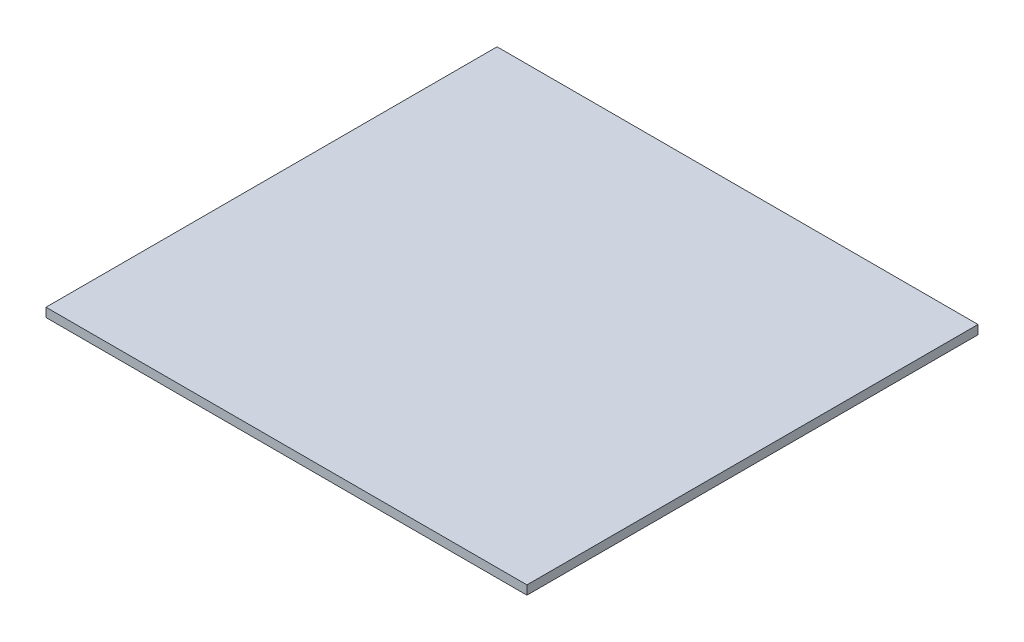
ISO-10303-21;
HEADER;
FILE_DESCRIPTION(('STEP AP214'),'2;1');
FILE_NAME('part.step','',(''),(''),'','','');
FILE_SCHEMA(('AUTOMOTIVE_DESIGN { 1 0 10303 214 1 1 1 1 }'));
ENDSEC;
DATA;
#1=APPLICATION_CONTEXT('core data for automotive mechanical design processes');
#2=APPLICATION_PROTOCOL_DEFINITION('international standard','automotive_design',2000,#1);
#3=PRODUCT_CONTEXT('',#1,'mechanical');
#4=PRODUCT('Part','Part','',(#3));
#5=PRODUCT_RELATED_PRODUCT_CATEGORY('part','',(#4));
#6=PRODUCT_DEFINITION_FORMATION('','',#4);
#7=PRODUCT_DEFINITION_CONTEXT('part definition',#1,'design');
#8=PRODUCT_DEFINITION('design','',#6,#7);
#9=PRODUCT_DEFINITION_SHAPE('','',#8);
#10=(LENGTH_UNIT() NAMED_UNIT(*) SI_UNIT(.MILLI.,.METRE.));
#11=(NAMED_UNIT(*) PLANE_ANGLE_UNIT() SI_UNIT($,.RADIAN.));
#12=(NAMED_UNIT(*) SI_UNIT($,.STERADIAN.) SOLID_ANGLE_UNIT());
#13=UNCERTAINTY_MEASURE_WITH_UNIT(LENGTH_MEASURE(1.E-05),#10,'distance_accuracy_value','');
#14=(GEOMETRIC_REPRESENTATION_CONTEXT(3) GLOBAL_UNCERTAINTY_ASSIGNED_CONTEXT((#13)) GLOBAL_UNIT_ASSIGNED_CONTEXT((#10,
#11,#12)) REPRESENTATION_CONTEXT('',''));
#15=CARTESIAN_POINT('',(0.,0.,0.));
#16=DIRECTION('',(0.,0.,1.));
#17=DIRECTION('',(1.,0.,0.));
#18=AXIS2_PLACEMENT_3D('',#15,#16,#17);
#19=CARTESIAN_POINT('',(44.7640186915888,3.,-164.207684319834));
#20=DIRECTION('',(-1.,0.,0.));
#21=DIRECTION('',(0.,0.,1.));
#22=AXIS2_PLACEMENT_3D('',#19,#20,#21);
#23=PLANE('',#22);
#24=DIRECTION('',(0.,0.,-1.));
#25=VECTOR('',#24,1.);
#26=CARTESIAN_POINT('',(44.7640186915888,0.,-164.207684319834));
#27=LINE('',#26,#25);
#28=CARTESIAN_POINT('',(44.7640186915888,0.,-13.2076843198339));
#29=VERTEX_POINT('',#28);
#30=CARTESIAN_POINT('',(44.7640186915888,0.,-164.207684319834));
#31=VERTEX_POINT('',#30);
#32=EDGE_CURVE('E98',#29,#31,#27,.T.);
#33=ORIENTED_EDGE('',*,*,#32,.T.);
#34=DIRECTION('',(0.,-1.,0.));
#35=VECTOR('',#34,1.);
#36=CARTESIAN_POINT('',(44.7640186915888,3.,-164.207684319834));
#37=LINE('',#36,#35);
#38=CARTESIAN_POINT('',(44.7640186915888,3.,-164.207684319834));
#39=VERTEX_POINT('',#38);
#40=EDGE_CURVE('E11',#39,#31,#37,.T.);
#41=ORIENTED_EDGE('',*,*,#40,.F.);
#42=DIRECTION('',(0.,0.,-1.));
#43=VECTOR('',#42,1.);
#44=CARTESIAN_POINT('',(44.7640186915888,3.,-164.207684319834));
#45=LINE('',#44,#43);
#46=CARTESIAN_POINT('',(44.7640186915888,3.,-13.2076843198339));
#47=VERTEX_POINT('',#46);
#48=EDGE_CURVE('E86',#47,#39,#45,.T.);
#49=ORIENTED_EDGE('',*,*,#48,.F.);
#50=DIRECTION('',(0.,-1.,0.));
#51=VECTOR('',#50,1.);
#52=CARTESIAN_POINT('',(44.7640186915888,3.,-13.2076843198339));
#53=LINE('',#52,#51);
#54=EDGE_CURVE('E94',#47,#29,#53,.T.);
#55=ORIENTED_EDGE('',*,*,#54,.T.);
#56=EDGE_LOOP('',(#33,#41,#49,#55));
#57=FACE_BOUND('',#56,.T.);
#58=ADVANCED_FACE('F35',(#57),#23,.F.);
#59=CARTESIAN_POINT('',(-116.235981308411,3.,-164.207684319834));
#60=DIRECTION('',(0.,0.,1.));
#61=DIRECTION('',(1.,0.,0.));
#62=AXIS2_PLACEMENT_3D('',#59,#60,#61);
#63=PLANE('',#62);
#64=DIRECTION('',(-1.,0.,0.));
#65=VECTOR('',#64,1.);
#66=CARTESIAN_POINT('',(-116.235981308411,0.,-164.207684319834));
#67=LINE('',#66,#65);
#68=CARTESIAN_POINT('',(-116.235981308411,0.,-164.207684319834));
#69=VERTEX_POINT('',#68);
#70=EDGE_CURVE('E90',#31,#69,#67,.T.);
#71=ORIENTED_EDGE('',*,*,#70,.T.);
#72=DIRECTION('',(0.,-1.,0.));
#73=VECTOR('',#72,1.);
#74=CARTESIAN_POINT('',(-116.235981308411,3.,-164.207684319834));
#75=LINE('',#74,#73);
#76=CARTESIAN_POINT('',(-116.235981308411,3.,-164.207684319834));
#77=VERTEX_POINT('',#76);
#78=EDGE_CURVE('E43',#77,#69,#75,.T.);
#79=ORIENTED_EDGE('',*,*,#78,.F.);
#80=DIRECTION('',(-1.,0.,0.));
#81=VECTOR('',#80,1.);
#82=CARTESIAN_POINT('',(-116.235981308411,3.,-164.207684319834));
#83=LINE('',#82,#81);
#84=EDGE_CURVE('E81',#39,#77,#83,.T.);
#85=ORIENTED_EDGE('',*,*,#84,.F.);
#86=ORIENTED_EDGE('',*,*,#40,.T.);
#87=EDGE_LOOP('',(#71,#79,#85,#86));
#88=FACE_BOUND('',#87,.T.);
#89=ADVANCED_FACE('F89',(#88),#63,.F.);
#90=CARTESIAN_POINT('',(-116.235981308411,3.,-164.207684319834));
#91=DIRECTION('',(1.,0.,0.));
#92=DIRECTION('',(0.,0.,-1.));
#93=AXIS2_PLACEMENT_3D('',#90,#91,#92);
#94=PLANE('',#93);
#95=DIRECTION('',(0.,0.,1.));
#96=VECTOR('',#95,1.);
#97=CARTESIAN_POINT('',(-116.235981308411,0.,-164.207684319834));
#98=LINE('',#97,#96);
#99=CARTESIAN_POINT('',(-116.235981308411,0.,-13.2076843198339));
#100=VERTEX_POINT('',#99);
#101=EDGE_CURVE('E68',#69,#100,#98,.T.);
#102=ORIENTED_EDGE('',*,*,#101,.T.);
#103=DIRECTION('',(0.,-1.,0.));
#104=VECTOR('',#103,1.);
#105=CARTESIAN_POINT('',(-116.235981308411,3.,-13.2076843198339));
#106=LINE('',#105,#104);
#107=CARTESIAN_POINT('',(-116.235981308411,3.,-13.2076843198339));
#108=VERTEX_POINT('',#107);
#109=EDGE_CURVE('E91',#108,#100,#106,.T.);
#110=ORIENTED_EDGE('',*,*,#109,.F.);
#111=DIRECTION('',(0.,0.,1.));
#112=VECTOR('',#111,1.);
#113=CARTESIAN_POINT('',(-116.235981308411,3.,-164.207684319834));
#114=LINE('',#113,#112);
#115=EDGE_CURVE('E84',#77,#108,#114,.T.);
#116=ORIENTED_EDGE('',*,*,#115,.F.);
#117=ORIENTED_EDGE('',*,*,#78,.T.);
#118=EDGE_LOOP('',(#102,#110,#116,#117));
#119=FACE_BOUND('',#118,.T.);
#120=ADVANCED_FACE('F92',(#119),#94,.F.);
#121=CARTESIAN_POINT('',(-116.235981308411,3.,-13.2076843198339));
#122=DIRECTION('',(0.,0.,-1.));
#123=DIRECTION('',(-1.,0.,0.));
#124=AXIS2_PLACEMENT_3D('',#121,#122,#123);
#125=PLANE('',#124);
#126=DIRECTION('',(1.,0.,0.));
#127=VECTOR('',#126,1.);
#128=CARTESIAN_POINT('',(-116.235981308411,0.,-13.2076843198339));
#129=LINE('',#128,#127);
#130=EDGE_CURVE('E74',#100,#29,#129,.T.);
#131=ORIENTED_EDGE('',*,*,#130,.T.);
#132=ORIENTED_EDGE('',*,*,#54,.F.);
#133=DIRECTION('',(1.,0.,0.));
#134=VECTOR('',#133,1.);
#135=CARTESIAN_POINT('',(-116.235981308411,3.,-13.2076843198339));
#136=LINE('',#135,#134);
#137=EDGE_CURVE('E51',#108,#47,#136,.T.);
#138=ORIENTED_EDGE('',*,*,#137,.F.);
#139=ORIENTED_EDGE('',*,*,#109,.T.);
#140=EDGE_LOOP('',(#131,#132,#138,#139));
#141=FACE_BOUND('',#140,.T.);
#142=ADVANCED_FACE('F105',(#141),#125,.F.);
#143=CARTESIAN_POINT('',(0.,3.,0.));
#144=DIRECTION('',(0.,1.,0.));
#145=DIRECTION('',(0.,0.,1.));
#146=AXIS2_PLACEMENT_3D('',#143,#144,#145);
#147=PLANE('',#146);
#148=ORIENTED_EDGE('',*,*,#48,.T.);
#149=ORIENTED_EDGE('',*,*,#84,.T.);
#150=ORIENTED_EDGE('',*,*,#115,.T.);
#151=ORIENTED_EDGE('',*,*,#137,.T.);
#152=EDGE_LOOP('',(#148,#149,#150,#151));
#153=FACE_BOUND('',#152,.T.);
#154=ADVANCED_FACE('F82',(#153),#147,.T.);
#155=CARTESIAN_POINT('',(0.,0.,0.));
#156=DIRECTION('',(0.,1.,0.));
#157=DIRECTION('',(0.,0.,1.));
#158=AXIS2_PLACEMENT_3D('',#155,#156,#157);
#159=PLANE('',#158);
#160=ORIENTED_EDGE('',*,*,#32,.F.);
#161=ORIENTED_EDGE('',*,*,#130,.F.);
#162=ORIENTED_EDGE('',*,*,#101,.F.);
#163=ORIENTED_EDGE('',*,*,#70,.F.);
#164=EDGE_LOOP('',(#160,#161,#162,#163));
#165=FACE_BOUND('',#164,.T.);
#166=ADVANCED_FACE('F108',(#165),#159,.F.);
#167=CLOSED_SHELL('',(#58,#89,#120,#142,#154,#166));
#168=MANIFOLD_SOLID_BREP('B2',#167);
#169=ADVANCED_BREP_SHAPE_REPRESENTATION('',(#18,#168),#14);
#170=SHAPE_DEFINITION_REPRESENTATION(#9,#169);
ENDSEC;
END-ISO-10303-21;
